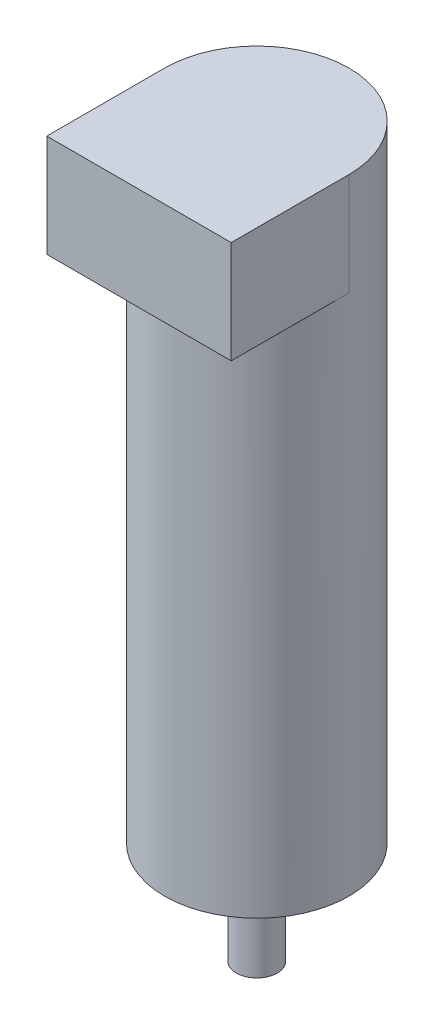
ISO-10303-21;
HEADER;
FILE_DESCRIPTION(('STEP AP214'),'2;1');
FILE_NAME('part.step','',(''),(''),'','','');
FILE_SCHEMA(('AUTOMOTIVE_DESIGN { 1 0 10303 214 1 1 1 1 }'));
ENDSEC;
DATA;
#1=APPLICATION_CONTEXT('core data for automotive mechanical design processes');
#2=APPLICATION_PROTOCOL_DEFINITION('international standard','automotive_design',2000,#1);
#3=PRODUCT_CONTEXT('',#1,'mechanical');
#4=PRODUCT('Part','Part','',(#3));
#5=PRODUCT_RELATED_PRODUCT_CATEGORY('part','',(#4));
#6=PRODUCT_DEFINITION_FORMATION('','',#4);
#7=PRODUCT_DEFINITION_CONTEXT('part definition',#1,'design');
#8=PRODUCT_DEFINITION('design','',#6,#7);
#9=PRODUCT_DEFINITION_SHAPE('','',#8);
#10=(LENGTH_UNIT() NAMED_UNIT(*) SI_UNIT(.MILLI.,.METRE.));
#11=(NAMED_UNIT(*) PLANE_ANGLE_UNIT() SI_UNIT($,.RADIAN.));
#12=(NAMED_UNIT(*) SI_UNIT($,.STERADIAN.) SOLID_ANGLE_UNIT());
#13=UNCERTAINTY_MEASURE_WITH_UNIT(LENGTH_MEASURE(1.E-05),#10,'distance_accuracy_value','');
#14=(GEOMETRIC_REPRESENTATION_CONTEXT(3) GLOBAL_UNCERTAINTY_ASSIGNED_CONTEXT((#13)) GLOBAL_UNIT_ASSIGNED_CONTEXT((#10,
#11,#12)) REPRESENTATION_CONTEXT('',''));
#15=CARTESIAN_POINT('',(0.,0.,0.));
#16=DIRECTION('',(0.,0.,1.));
#17=DIRECTION('',(1.,0.,0.));
#18=AXIS2_PLACEMENT_3D('',#15,#16,#17);
#19=CARTESIAN_POINT('',(0.,102.,0.));
#20=DIRECTION('',(0.,-1.,0.));
#21=DIRECTION('',(0.,0.,-1.));
#22=AXIS2_PLACEMENT_3D('',#19,#20,#21);
#23=CYLINDRICAL_SURFACE('',#22,18.);
#24=CARTESIAN_POINT('',(0.,102.,0.));
#25=DIRECTION('',(0.,1.,0.));
#26=DIRECTION('',(0.,0.,1.));
#27=AXIS2_PLACEMENT_3D('',#24,#25,#26);
#28=CIRCLE('',#27,18.);
#29=CARTESIAN_POINT('',(-18.,102.,0.));
#30=VERTEX_POINT('',#29);
#31=CARTESIAN_POINT('',(18.,102.,0.));
#32=VERTEX_POINT('',#31);
#33=EDGE_CURVE('E55',#30,#32,#28,.T.);
#34=ORIENTED_EDGE('',*,*,#33,.F.);
#35=DIRECTION('',(0.,-1.,0.));
#36=VECTOR('',#35,1.);
#37=CARTESIAN_POINT('',(-18.,122.,0.));
#38=LINE('',#37,#36);
#39=CARTESIAN_POINT('',(-18.,122.,0.));
#40=VERTEX_POINT('',#39);
#41=EDGE_CURVE('E98',#40,#30,#38,.T.);
#42=ORIENTED_EDGE('',*,*,#41,.F.);
#43=CARTESIAN_POINT('',(0.,122.,0.));
#44=DIRECTION('',(0.,1.,0.));
#45=DIRECTION('',(0.,0.,-1.));
#46=AXIS2_PLACEMENT_3D('',#43,#44,#45);
#47=CIRCLE('',#46,18.);
#48=CARTESIAN_POINT('',(18.,122.,0.));
#49=VERTEX_POINT('',#48);
#50=EDGE_CURVE('E105',#49,#40,#47,.T.);
#51=ORIENTED_EDGE('',*,*,#50,.F.);
#52=DIRECTION('',(0.,-1.,0.));
#53=VECTOR('',#52,1.);
#54=CARTESIAN_POINT('',(18.,122.,0.));
#55=LINE('',#54,#53);
#56=EDGE_CURVE('E405',#49,#32,#55,.T.);
#57=ORIENTED_EDGE('',*,*,#56,.T.);
#58=EDGE_LOOP('',(#34,#42,#51,#57));
#59=FACE_BOUND('',#58,.T.);
#60=CARTESIAN_POINT('',(0.,0.,0.));
#61=DIRECTION('',(0.,1.,0.));
#62=DIRECTION('',(0.,0.,1.));
#63=AXIS2_PLACEMENT_3D('',#60,#61,#62);
#64=CIRCLE('',#63,18.);
#65=CARTESIAN_POINT('',(0.,0.,18.));
#66=VERTEX_POINT('',#65);
#67=EDGE_CURVE('E176',#66,#66,#64,.T.);
#68=ORIENTED_EDGE('',*,*,#67,.T.);
#69=EDGE_LOOP('',(#68));
#70=FACE_BOUND('',#69,.T.);
#71=ADVANCED_FACE('F39',(#59,#70),#23,.T.);
#72=CARTESIAN_POINT('',(0.,0.,0.));
#73=DIRECTION('',(0.,1.,0.));
#74=DIRECTION('',(0.,0.,1.));
#75=AXIS2_PLACEMENT_3D('',#72,#73,#74);
#76=PLANE('',#75);
#77=CARTESIAN_POINT('',(0.,0.,0.));
#78=DIRECTION('',(0.,1.,0.));
#79=DIRECTION('',(0.,0.,1.));
#80=AXIS2_PLACEMENT_3D('',#77,#78,#79);
#81=CIRCLE('',#80,11.);
#82=CARTESIAN_POINT('',(0.,0.,11.));
#83=VERTEX_POINT('',#82);
#84=EDGE_CURVE('E42',#83,#83,#81,.F.);
#85=ORIENTED_EDGE('',*,*,#84,.F.);
#86=EDGE_LOOP('',(#85));
#87=FACE_BOUND('',#86,.T.);
#88=CARTESIAN_POINT('',(0.,0.,15.));
#89=DIRECTION('',(0.,-1.,0.));
#90=DIRECTION('',(-1.,0.,0.));
#91=AXIS2_PLACEMENT_3D('',#88,#89,#90);
#92=CIRCLE('',#91,1.5);
#93=CARTESIAN_POINT('',(-1.49999999999995,0.,15.));
#94=VERTEX_POINT('',#93);
#95=EDGE_CURVE('E153',#94,#94,#92,.T.);
#96=ORIENTED_EDGE('',*,*,#95,.F.);
#97=EDGE_LOOP('',(#96));
#98=FACE_BOUND('',#97,.T.);
#99=CARTESIAN_POINT('',(15.,0.,0.));
#100=DIRECTION('',(0.,-1.,0.));
#101=DIRECTION('',(0.,0.,1.));
#102=AXIS2_PLACEMENT_3D('',#99,#100,#101);
#103=CIRCLE('',#102,1.5);
#104=CARTESIAN_POINT('',(15.,0.,1.5));
#105=VERTEX_POINT('',#104);
#106=EDGE_CURVE('E161',#105,#105,#103,.T.);
#107=ORIENTED_EDGE('',*,*,#106,.F.);
#108=EDGE_LOOP('',(#107));
#109=FACE_BOUND('',#108,.T.);
#110=CARTESIAN_POINT('',(-1.57116660247941E-13,0.,-15.));
#111=DIRECTION('',(0.,-1.,0.));
#112=DIRECTION('',(1.,0.,0.));
#113=AXIS2_PLACEMENT_3D('',#110,#111,#112);
#114=CIRCLE('',#113,1.5);
#115=CARTESIAN_POINT('',(1.49999999999984,0.,-15.));
#116=VERTEX_POINT('',#115);
#117=EDGE_CURVE('E147',#116,#116,#114,.T.);
#118=ORIENTED_EDGE('',*,*,#117,.F.);
#119=EDGE_LOOP('',(#118));
#120=FACE_BOUND('',#119,.T.);
#121=CARTESIAN_POINT('',(-15.,0.,0.));
#122=DIRECTION('',(0.,-1.,0.));
#123=DIRECTION('',(0.,0.,-1.));
#124=AXIS2_PLACEMENT_3D('',#121,#122,#123);
#125=CIRCLE('',#124,1.5);
#126=CARTESIAN_POINT('',(-15.,0.,-1.5));
#127=VERTEX_POINT('',#126);
#128=EDGE_CURVE('E152',#127,#127,#125,.T.);
#129=ORIENTED_EDGE('',*,*,#128,.F.);
#130=EDGE_LOOP('',(#129));
#131=FACE_BOUND('',#130,.T.);
#132=ORIENTED_EDGE('',*,*,#67,.F.);
#133=EDGE_LOOP('',(#132));
#134=FACE_BOUND('',#133,.T.);
#135=ADVANCED_FACE('F185',(#87,#98,#109,#120,#131,#134),#76,.F.);
#136=CARTESIAN_POINT('',(-15.,5.,0.));
#137=DIRECTION('',(0.,-1.,0.));
#138=DIRECTION('',(0.,0.,-1.));
#139=AXIS2_PLACEMENT_3D('',#136,#137,#138);
#140=CYLINDRICAL_SURFACE('',#139,1.5);
#141=CARTESIAN_POINT('',(-15.,5.,0.));
#142=DIRECTION('',(0.,-1.,0.));
#143=DIRECTION('',(0.,0.,-1.));
#144=AXIS2_PLACEMENT_3D('',#141,#142,#143);
#145=CIRCLE('',#144,1.5);
#146=CARTESIAN_POINT('',(-15.,5.,-1.5));
#147=VERTEX_POINT('',#146);
#148=EDGE_CURVE('E172',#147,#147,#145,.T.);
#149=ORIENTED_EDGE('',*,*,#148,.F.);
#150=EDGE_LOOP('',(#149));
#151=FACE_BOUND('',#150,.T.);
#152=ORIENTED_EDGE('',*,*,#128,.T.);
#153=EDGE_LOOP('',(#152));
#154=FACE_BOUND('',#153,.T.);
#155=ADVANCED_FACE('F187',(#151,#154),#140,.F.);
#156=CARTESIAN_POINT('',(-15.,5.,0.));
#157=DIRECTION('',(0.,-1.,0.));
#158=DIRECTION('',(0.,0.,-1.));
#159=AXIS2_PLACEMENT_3D('',#156,#157,#158);
#160=PLANE('',#159);
#161=ORIENTED_EDGE('',*,*,#148,.T.);
#162=EDGE_LOOP('',(#161));
#163=FACE_BOUND('',#162,.T.);
#164=ADVANCED_FACE('F193',(#163),#160,.T.);
#165=CARTESIAN_POINT('',(-1.57116660247941E-13,5.,-15.));
#166=DIRECTION('',(0.,-1.,0.));
#167=DIRECTION('',(0.,0.,-1.));
#168=AXIS2_PLACEMENT_3D('',#165,#166,#167);
#169=CYLINDRICAL_SURFACE('',#168,1.5);
#170=CARTESIAN_POINT('',(-1.57116660247941E-13,5.,-15.));
#171=DIRECTION('',(0.,-1.,0.));
#172=DIRECTION('',(1.,0.,0.));
#173=AXIS2_PLACEMENT_3D('',#170,#171,#172);
#174=CIRCLE('',#173,1.5);
#175=CARTESIAN_POINT('',(1.49999999999984,5.,-15.));
#176=VERTEX_POINT('',#175);
#177=EDGE_CURVE('E165',#176,#176,#174,.T.);
#178=ORIENTED_EDGE('',*,*,#177,.F.);
#179=EDGE_LOOP('',(#178));
#180=FACE_BOUND('',#179,.T.);
#181=ORIENTED_EDGE('',*,*,#117,.T.);
#182=EDGE_LOOP('',(#181));
#183=FACE_BOUND('',#182,.T.);
#184=ADVANCED_FACE('F201',(#180,#183),#169,.F.);
#185=CARTESIAN_POINT('',(-1.57116660247941E-13,5.,-15.));
#186=DIRECTION('',(0.,-1.,0.));
#187=DIRECTION('',(1.,0.,0.));
#188=AXIS2_PLACEMENT_3D('',#185,#186,#187);
#189=PLANE('',#188);
#190=ORIENTED_EDGE('',*,*,#177,.T.);
#191=EDGE_LOOP('',(#190));
#192=FACE_BOUND('',#191,.T.);
#193=ADVANCED_FACE('F205',(#192),#189,.T.);
#194=CARTESIAN_POINT('',(15.,5.,0.));
#195=DIRECTION('',(0.,-1.,0.));
#196=DIRECTION('',(0.,0.,-1.));
#197=AXIS2_PLACEMENT_3D('',#194,#195,#196);
#198=CYLINDRICAL_SURFACE('',#197,1.5);
#199=CARTESIAN_POINT('',(15.,5.,0.));
#200=DIRECTION('',(0.,-1.,0.));
#201=DIRECTION('',(0.,0.,1.));
#202=AXIS2_PLACEMENT_3D('',#199,#200,#201);
#203=CIRCLE('',#202,1.5);
#204=CARTESIAN_POINT('',(15.,5.,1.5));
#205=VERTEX_POINT('',#204);
#206=EDGE_CURVE('E157',#205,#205,#203,.T.);
#207=ORIENTED_EDGE('',*,*,#206,.F.);
#208=EDGE_LOOP('',(#207));
#209=FACE_BOUND('',#208,.T.);
#210=ORIENTED_EDGE('',*,*,#106,.T.);
#211=EDGE_LOOP('',(#210));
#212=FACE_BOUND('',#211,.T.);
#213=ADVANCED_FACE('F209',(#209,#212),#198,.F.);
#214=CARTESIAN_POINT('',(15.,5.,0.));
#215=DIRECTION('',(0.,-1.,0.));
#216=DIRECTION('',(0.,0.,1.));
#217=AXIS2_PLACEMENT_3D('',#214,#215,#216);
#218=PLANE('',#217);
#219=ORIENTED_EDGE('',*,*,#206,.T.);
#220=EDGE_LOOP('',(#219));
#221=FACE_BOUND('',#220,.T.);
#222=ADVANCED_FACE('F213',(#221),#218,.T.);
#223=CARTESIAN_POINT('',(0.,5.,15.));
#224=DIRECTION('',(0.,-1.,0.));
#225=DIRECTION('',(0.,0.,-1.));
#226=AXIS2_PLACEMENT_3D('',#223,#224,#225);
#227=CYLINDRICAL_SURFACE('',#226,1.5);
#228=CARTESIAN_POINT('',(0.,5.,15.));
#229=DIRECTION('',(0.,-1.,0.));
#230=DIRECTION('',(-1.,0.,0.));
#231=AXIS2_PLACEMENT_3D('',#228,#229,#230);
#232=CIRCLE('',#231,1.5);
#233=CARTESIAN_POINT('',(-1.49999999999995,5.,15.));
#234=VERTEX_POINT('',#233);
#235=EDGE_CURVE('E148',#234,#234,#232,.T.);
#236=ORIENTED_EDGE('',*,*,#235,.F.);
#237=EDGE_LOOP('',(#236));
#238=FACE_BOUND('',#237,.T.);
#239=ORIENTED_EDGE('',*,*,#95,.T.);
#240=EDGE_LOOP('',(#239));
#241=FACE_BOUND('',#240,.T.);
#242=ADVANCED_FACE('F217',(#238,#241),#227,.F.);
#243=CARTESIAN_POINT('',(0.,5.,15.));
#244=DIRECTION('',(0.,-1.,0.));
#245=DIRECTION('',(-1.,0.,0.));
#246=AXIS2_PLACEMENT_3D('',#243,#244,#245);
#247=PLANE('',#246);
#248=ORIENTED_EDGE('',*,*,#235,.T.);
#249=EDGE_LOOP('',(#248));
#250=FACE_BOUND('',#249,.T.);
#251=ADVANCED_FACE('F221',(#250),#247,.T.);
#252=CARTESIAN_POINT('',(0.,-3.,0.));
#253=DIRECTION('',(0.,1.,0.));
#254=DIRECTION('',(0.,0.,1.));
#255=AXIS2_PLACEMENT_3D('',#252,#253,#254);
#256=CYLINDRICAL_SURFACE('',#255,11.);
#257=CARTESIAN_POINT('',(0.,-3.,0.));
#258=DIRECTION('',(0.,-1.,0.));
#259=DIRECTION('',(0.,0.,-1.));
#260=AXIS2_PLACEMENT_3D('',#257,#258,#259);
#261=CIRCLE('',#260,11.);
#262=CARTESIAN_POINT('',(0.,-3.,-11.));
#263=VERTEX_POINT('',#262);
#264=EDGE_CURVE('E142',#263,#263,#261,.T.);
#265=ORIENTED_EDGE('',*,*,#264,.F.);
#266=EDGE_LOOP('',(#265));
#267=FACE_BOUND('',#266,.T.);
#268=ORIENTED_EDGE('',*,*,#84,.T.);
#269=EDGE_LOOP('',(#268));
#270=FACE_BOUND('',#269,.T.);
#271=ADVANCED_FACE('F225',(#267,#270),#256,.T.);
#272=CARTESIAN_POINT('',(0.,-3.,0.));
#273=DIRECTION('',(0.,-1.,0.));
#274=DIRECTION('',(0.,0.,-1.));
#275=AXIS2_PLACEMENT_3D('',#272,#273,#274);
#276=PLANE('',#275);
#277=CARTESIAN_POINT('',(0.,-3.,0.));
#278=DIRECTION('',(0.,-1.,0.));
#279=DIRECTION('',(0.,0.,-1.));
#280=AXIS2_PLACEMENT_3D('',#277,#278,#279);
#281=CIRCLE('',#280,4.);
#282=CARTESIAN_POINT('',(0.,-3.,-4.));
#283=VERTEX_POINT('',#282);
#284=EDGE_CURVE('E11',#283,#283,#281,.T.);
#285=ORIENTED_EDGE('',*,*,#284,.F.);
#286=EDGE_LOOP('',(#285));
#287=FACE_BOUND('',#286,.T.);
#288=ORIENTED_EDGE('',*,*,#264,.T.);
#289=EDGE_LOOP('',(#288));
#290=FACE_BOUND('',#289,.T.);
#291=ADVANCED_FACE('F229',(#287,#290),#276,.T.);
#292=CARTESIAN_POINT('',(0.,-20.,0.));
#293=DIRECTION('',(0.,1.,0.));
#294=DIRECTION('',(0.,0.,1.));
#295=AXIS2_PLACEMENT_3D('',#292,#293,#294);
#296=CYLINDRICAL_SURFACE('',#295,4.);
#297=CARTESIAN_POINT('',(0.,-20.,0.));
#298=DIRECTION('',(0.,-1.,0.));
#299=DIRECTION('',(0.,0.,-1.));
#300=AXIS2_PLACEMENT_3D('',#297,#298,#299);
#301=CIRCLE('',#300,4.);
#302=CARTESIAN_POINT('',(2.64575131106459,-20.,-3.));
#303=VERTEX_POINT('',#302);
#304=CARTESIAN_POINT('',(-2.64575131106459,-20.,-3.));
#305=VERTEX_POINT('',#304);
#306=EDGE_CURVE('E137',#303,#305,#301,.T.);
#307=ORIENTED_EDGE('',*,*,#306,.F.);
#308=DIRECTION('',(0.,-1.,0.));
#309=VECTOR('',#308,1.);
#310=CARTESIAN_POINT('',(2.64575131106459,-5.,-3.));
#311=LINE('',#310,#309);
#312=CARTESIAN_POINT('',(2.64575131106459,-5.,-3.));
#313=VERTEX_POINT('',#312);
#314=EDGE_CURVE('E63',#313,#303,#311,.T.);
#315=ORIENTED_EDGE('',*,*,#314,.F.);
#316=CARTESIAN_POINT('',(0.,-5.,0.));
#317=DIRECTION('',(0.,-1.,0.));
#318=DIRECTION('',(0.,0.,1.));
#319=AXIS2_PLACEMENT_3D('',#316,#317,#318);
#320=CIRCLE('',#319,4.);
#321=CARTESIAN_POINT('',(-2.64575131106459,-5.,-3.));
#322=VERTEX_POINT('',#321);
#323=EDGE_CURVE('E121',#322,#313,#320,.T.);
#324=ORIENTED_EDGE('',*,*,#323,.F.);
#325=DIRECTION('',(0.,-1.,0.));
#326=VECTOR('',#325,1.);
#327=CARTESIAN_POINT('',(-2.64575131106459,-5.,-3.));
#328=LINE('',#327,#326);
#329=EDGE_CURVE('E133',#322,#305,#328,.T.);
#330=ORIENTED_EDGE('',*,*,#329,.T.);
#331=EDGE_LOOP('',(#307,#315,#324,#330));
#332=FACE_BOUND('',#331,.T.);
#333=ORIENTED_EDGE('',*,*,#284,.T.);
#334=EDGE_LOOP('',(#333));
#335=FACE_BOUND('',#334,.T.);
#336=ADVANCED_FACE('F233',(#332,#335),#296,.T.);
#337=CARTESIAN_POINT('',(0.,-20.,0.));
#338=DIRECTION('',(0.,-1.,0.));
#339=DIRECTION('',(0.,0.,-1.));
#340=AXIS2_PLACEMENT_3D('',#337,#338,#339);
#341=PLANE('',#340);
#342=DIRECTION('',(-1.,0.,0.));
#343=VECTOR('',#342,1.);
#344=CARTESIAN_POINT('',(-2.64575131106459,-20.,-3.));
#345=LINE('',#344,#343);
#346=EDGE_CURVE('E117',#303,#305,#345,.T.);
#347=ORIENTED_EDGE('',*,*,#346,.F.);
#348=ORIENTED_EDGE('',*,*,#306,.T.);
#349=EDGE_LOOP('',(#347,#348));
#350=FACE_BOUND('',#349,.T.);
#351=ADVANCED_FACE('F237',(#350),#341,.T.);
#352=CARTESIAN_POINT('',(-2.64575131106459,-5.,-3.));
#353=DIRECTION('',(0.,0.,1.));
#354=DIRECTION('',(1.,0.,0.));
#355=AXIS2_PLACEMENT_3D('',#352,#353,#354);
#356=PLANE('',#355);
#357=ORIENTED_EDGE('',*,*,#346,.T.);
#358=ORIENTED_EDGE('',*,*,#329,.F.);
#359=DIRECTION('',(-1.,0.,0.));
#360=VECTOR('',#359,1.);
#361=CARTESIAN_POINT('',(-2.64575131106459,-5.,-3.));
#362=LINE('',#361,#360);
#363=EDGE_CURVE('E129',#313,#322,#362,.T.);
#364=ORIENTED_EDGE('',*,*,#363,.F.);
#365=ORIENTED_EDGE('',*,*,#314,.T.);
#366=EDGE_LOOP('',(#357,#358,#364,#365));
#367=FACE_BOUND('',#366,.T.);
#368=ADVANCED_FACE('F241',(#367),#356,.F.);
#369=CARTESIAN_POINT('',(0.,-5.,0.));
#370=DIRECTION('',(0.,1.,0.));
#371=DIRECTION('',(0.,0.,1.));
#372=AXIS2_PLACEMENT_3D('',#369,#370,#371);
#373=PLANE('',#372);
#374=ORIENTED_EDGE('',*,*,#323,.T.);
#375=ORIENTED_EDGE('',*,*,#363,.T.);
#376=EDGE_LOOP('',(#374,#375));
#377=FACE_BOUND('',#376,.T.);
#378=ADVANCED_FACE('F245',(#377),#373,.F.);
#379=CARTESIAN_POINT('',(-18.,122.,0.));
#380=DIRECTION('',(1.,0.,0.));
#381=DIRECTION('',(0.,0.,-1.));
#382=AXIS2_PLACEMENT_3D('',#379,#380,#381);
#383=PLANE('',#382);
#384=DIRECTION('',(0.,0.,1.));
#385=VECTOR('',#384,1.);
#386=CARTESIAN_POINT('',(-18.,102.,0.));
#387=LINE('',#386,#385);
#388=CARTESIAN_POINT('',(-18.,102.,23.));
#389=VERTEX_POINT('',#388);
#390=EDGE_CURVE('E392',#30,#389,#387,.T.);
#391=ORIENTED_EDGE('',*,*,#390,.T.);
#392=DIRECTION('',(0.,-1.,0.));
#393=VECTOR('',#392,1.);
#394=CARTESIAN_POINT('',(-18.,122.,23.));
#395=LINE('',#394,#393);
#396=CARTESIAN_POINT('',(-18.,122.,23.));
#397=VERTEX_POINT('',#396);
#398=EDGE_CURVE('E100',#397,#389,#395,.T.);
#399=ORIENTED_EDGE('',*,*,#398,.F.);
#400=DIRECTION('',(0.,0.,1.));
#401=VECTOR('',#400,1.);
#402=CARTESIAN_POINT('',(-18.,122.,0.));
#403=LINE('',#402,#401);
#404=EDGE_CURVE('E95',#40,#397,#403,.T.);
#405=ORIENTED_EDGE('',*,*,#404,.F.);
#406=ORIENTED_EDGE('',*,*,#41,.T.);
#407=EDGE_LOOP('',(#391,#399,#405,#406));
#408=FACE_BOUND('',#407,.T.);
#409=ADVANCED_FACE('F97',(#408),#383,.F.);
#410=CARTESIAN_POINT('',(-18.,122.,23.));
#411=DIRECTION('',(0.,0.,-1.));
#412=DIRECTION('',(-1.,0.,0.));
#413=AXIS2_PLACEMENT_3D('',#410,#411,#412);
#414=PLANE('',#413);
#415=DIRECTION('',(1.,0.,0.));
#416=VECTOR('',#415,1.);
#417=CARTESIAN_POINT('',(-18.,102.,23.));
#418=LINE('',#417,#416);
#419=CARTESIAN_POINT('',(18.,102.,23.));
#420=VERTEX_POINT('',#419);
#421=EDGE_CURVE('E395',#389,#420,#418,.T.);
#422=ORIENTED_EDGE('',*,*,#421,.T.);
#423=DIRECTION('',(0.,-1.,0.));
#424=VECTOR('',#423,1.);
#425=CARTESIAN_POINT('',(18.,122.,23.));
#426=LINE('',#425,#424);
#427=CARTESIAN_POINT('',(18.,122.,23.));
#428=VERTEX_POINT('',#427);
#429=EDGE_CURVE('E123',#428,#420,#426,.T.);
#430=ORIENTED_EDGE('',*,*,#429,.F.);
#431=DIRECTION('',(1.,0.,0.));
#432=VECTOR('',#431,1.);
#433=CARTESIAN_POINT('',(-18.,122.,23.));
#434=LINE('',#433,#432);
#435=EDGE_CURVE('E104',#397,#428,#434,.T.);
#436=ORIENTED_EDGE('',*,*,#435,.F.);
#437=ORIENTED_EDGE('',*,*,#398,.T.);
#438=EDGE_LOOP('',(#422,#430,#436,#437));
#439=FACE_BOUND('',#438,.T.);
#440=ADVANCED_FACE('F251',(#439),#414,.F.);
#441=CARTESIAN_POINT('',(18.,122.,0.));
#442=DIRECTION('',(-1.,0.,0.));
#443=DIRECTION('',(0.,0.,1.));
#444=AXIS2_PLACEMENT_3D('',#441,#442,#443);
#445=PLANE('',#444);
#446=DIRECTION('',(0.,0.,-1.));
#447=VECTOR('',#446,1.);
#448=CARTESIAN_POINT('',(18.,102.,0.));
#449=LINE('',#448,#447);
#450=EDGE_CURVE('E113',#420,#32,#449,.T.);
#451=ORIENTED_EDGE('',*,*,#450,.T.);
#452=ORIENTED_EDGE('',*,*,#56,.F.);
#453=DIRECTION('',(0.,0.,-1.));
#454=VECTOR('',#453,1.);
#455=CARTESIAN_POINT('',(18.,122.,0.));
#456=LINE('',#455,#454);
#457=EDGE_CURVE('E110',#428,#49,#456,.T.);
#458=ORIENTED_EDGE('',*,*,#457,.F.);
#459=ORIENTED_EDGE('',*,*,#429,.T.);
#460=EDGE_LOOP('',(#451,#452,#458,#459));
#461=FACE_BOUND('',#460,.T.);
#462=ADVANCED_FACE('F254',(#461),#445,.F.);
#463=CARTESIAN_POINT('',(0.,122.,0.));
#464=DIRECTION('',(0.,-1.,0.));
#465=DIRECTION('',(0.,0.,-1.));
#466=AXIS2_PLACEMENT_3D('',#463,#464,#465);
#467=PLANE('',#466);
#468=ORIENTED_EDGE('',*,*,#50,.T.);
#469=ORIENTED_EDGE('',*,*,#404,.T.);
#470=ORIENTED_EDGE('',*,*,#435,.T.);
#471=ORIENTED_EDGE('',*,*,#457,.T.);
#472=EDGE_LOOP('',(#468,#469,#470,#471));
#473=FACE_BOUND('',#472,.T.);
#474=ADVANCED_FACE('F108',(#473),#467,.F.);
#475=CARTESIAN_POINT('',(0.,102.,0.));
#476=DIRECTION('',(0.,-1.,0.));
#477=DIRECTION('',(0.,0.,-1.));
#478=AXIS2_PLACEMENT_3D('',#475,#476,#477);
#479=PLANE('',#478);
#480=ORIENTED_EDGE('',*,*,#390,.F.);
#481=ORIENTED_EDGE('',*,*,#33,.T.);
#482=ORIENTED_EDGE('',*,*,#450,.F.);
#483=ORIENTED_EDGE('',*,*,#421,.F.);
#484=EDGE_LOOP('',(#480,#481,#482,#483));
#485=FACE_BOUND('',#484,.T.);
#486=ADVANCED_FACE('F259',(#485),#479,.T.);
#487=CLOSED_SHELL('',(#71,#135,#155,#164,#184,#193,#213,#222,#242,#251,#271,#291,#336,#351,#368,
#378,#409,#440,#462,#474,#486));
#488=MANIFOLD_SOLID_BREP('B2',#487);
#489=ADVANCED_BREP_SHAPE_REPRESENTATION('',(#18,#488),#14);
#490=SHAPE_DEFINITION_REPRESENTATION(#9,#489);
ENDSEC;
END-ISO-10303-21;
